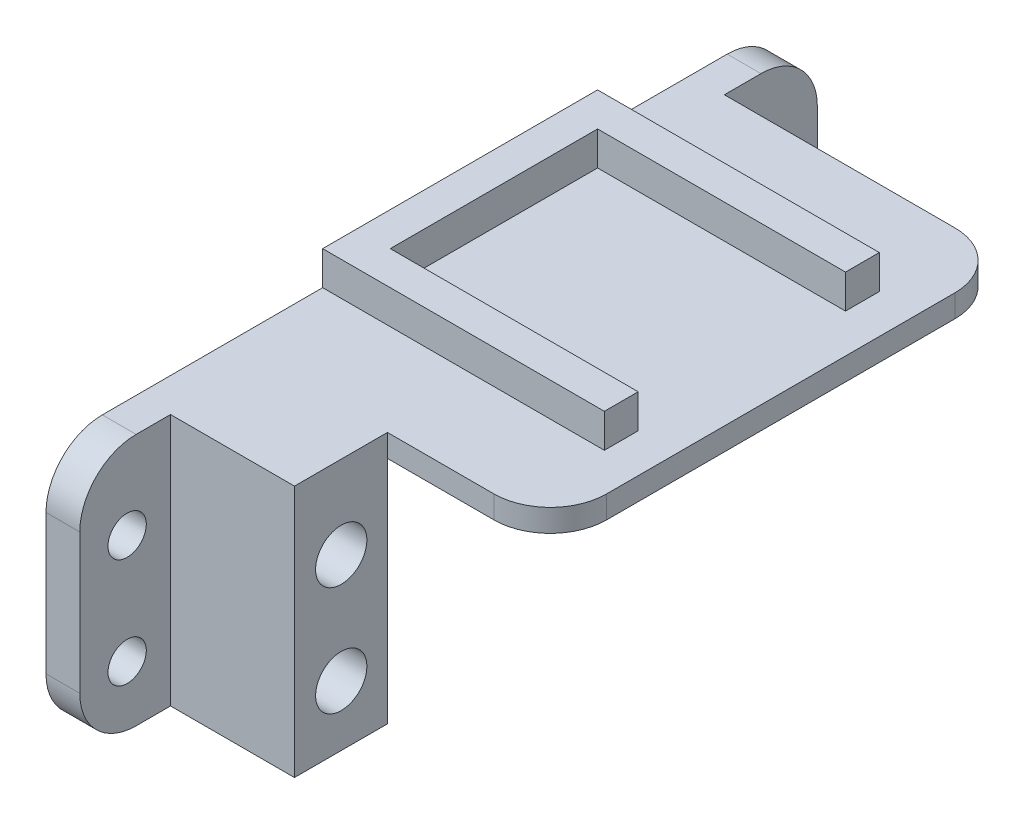
ISO-10303-21;
HEADER;
FILE_DESCRIPTION(('STEP AP214'),'2;1');
FILE_NAME('part.step','',(''),(''),'','','');
FILE_SCHEMA(('AUTOMOTIVE_DESIGN { 1 0 10303 214 1 1 1 1 }'));
ENDSEC;
DATA;
#1=APPLICATION_CONTEXT('core data for automotive mechanical design processes');
#2=APPLICATION_PROTOCOL_DEFINITION('international standard','automotive_design',2000,#1);
#3=PRODUCT_CONTEXT('',#1,'mechanical');
#4=PRODUCT('Part','Part','',(#3));
#5=PRODUCT_RELATED_PRODUCT_CATEGORY('part','',(#4));
#6=PRODUCT_DEFINITION_FORMATION('','',#4);
#7=PRODUCT_DEFINITION_CONTEXT('part definition',#1,'design');
#8=PRODUCT_DEFINITION('design','',#6,#7);
#9=PRODUCT_DEFINITION_SHAPE('','',#8);
#10=(LENGTH_UNIT() NAMED_UNIT(*) SI_UNIT(.MILLI.,.METRE.));
#11=(NAMED_UNIT(*) PLANE_ANGLE_UNIT() SI_UNIT($,.RADIAN.));
#12=(NAMED_UNIT(*) SI_UNIT($,.STERADIAN.) SOLID_ANGLE_UNIT());
#13=UNCERTAINTY_MEASURE_WITH_UNIT(LENGTH_MEASURE(1.E-05),#10,'distance_accuracy_value','');
#14=(GEOMETRIC_REPRESENTATION_CONTEXT(3) GLOBAL_UNCERTAINTY_ASSIGNED_CONTEXT((#13)) GLOBAL_UNIT_ASSIGNED_CONTEXT((#10,
#11,#12)) REPRESENTATION_CONTEXT('',''));
#15=CARTESIAN_POINT('',(0.,0.,0.));
#16=DIRECTION('',(0.,0.,1.));
#17=DIRECTION('',(1.,0.,0.));
#18=AXIS2_PLACEMENT_3D('',#15,#16,#17);
#19=CARTESIAN_POINT('',(0.,0.,0.));
#20=DIRECTION('',(0.,1.,0.));
#21=DIRECTION('',(0.,0.,1.));
#22=AXIS2_PLACEMENT_3D('',#19,#20,#21);
#23=PLANE('',#22);
#24=DIRECTION('',(0.,0.,-1.));
#25=VECTOR('',#24,1.);
#26=CARTESIAN_POINT('',(-6.07499999999999,0.,0.));
#27=LINE('',#26,#25);
#28=CARTESIAN_POINT('',(-6.07499999999999,0.,20.45));
#29=VERTEX_POINT('',#28);
#30=CARTESIAN_POINT('',(-6.07499999999999,0.,-20.45));
#31=VERTEX_POINT('',#30);
#32=EDGE_CURVE('E308',#29,#31,#27,.T.);
#33=ORIENTED_EDGE('',*,*,#32,.T.);
#34=DIRECTION('',(-1.,0.,0.));
#35=VECTOR('',#34,1.);
#36=CARTESIAN_POINT('',(0.,0.,-20.45));
#37=LINE('',#36,#35);
#38=CARTESIAN_POINT('',(-3.075,0.,-20.45));
#39=VERTEX_POINT('',#38);
#40=EDGE_CURVE('E272',#39,#31,#37,.T.);
#41=ORIENTED_EDGE('',*,*,#40,.F.);
#42=DIRECTION('',(-1.,0.,0.));
#43=VECTOR('',#42,1.);
#44=CARTESIAN_POINT('',(0.,0.,-20.45));
#45=LINE('',#44,#43);
#46=CARTESIAN_POINT('',(17.375,0.,-20.45));
#47=VERTEX_POINT('',#46);
#48=EDGE_CURVE('E337',#47,#39,#45,.T.);
#49=ORIENTED_EDGE('',*,*,#48,.F.);
#50=CARTESIAN_POINT('',(17.375,0.,-15.45));
#51=DIRECTION('',(0.,1.,0.));
#52=DIRECTION('',(0.,0.,1.));
#53=AXIS2_PLACEMENT_3D('',#50,#51,#52);
#54=CIRCLE('',#53,5.);
#55=CARTESIAN_POINT('',(22.375,0.,-15.45));
#56=VERTEX_POINT('',#55);
#57=EDGE_CURVE('E394',#47,#56,#54,.F.);
#58=ORIENTED_EDGE('',*,*,#57,.T.);
#59=DIRECTION('',(0.,0.,1.));
#60=VECTOR('',#59,1.);
#61=CARTESIAN_POINT('',(22.375,0.,0.));
#62=LINE('',#61,#60);
#63=CARTESIAN_POINT('',(22.375,0.,15.45));
#64=VERTEX_POINT('',#63);
#65=EDGE_CURVE('E334',#56,#64,#62,.T.);
#66=ORIENTED_EDGE('',*,*,#65,.T.);
#67=CARTESIAN_POINT('',(17.375,0.,15.45));
#68=DIRECTION('',(0.,1.,0.));
#69=DIRECTION('',(0.,0.,1.));
#70=AXIS2_PLACEMENT_3D('',#67,#68,#69);
#71=CIRCLE('',#70,5.);
#72=CARTESIAN_POINT('',(17.375,0.,20.45));
#73=VERTEX_POINT('',#72);
#74=EDGE_CURVE('E392',#64,#73,#71,.F.);
#75=ORIENTED_EDGE('',*,*,#74,.T.);
#76=DIRECTION('',(-1.,0.,0.));
#77=VECTOR('',#76,1.);
#78=CARTESIAN_POINT('',(0.,0.,20.45));
#79=LINE('',#78,#77);
#80=CARTESIAN_POINT('',(7.925,0.,20.45));
#81=VERTEX_POINT('',#80);
#82=EDGE_CURVE('E332',#73,#81,#79,.T.);
#83=ORIENTED_EDGE('',*,*,#82,.T.);
#84=DIRECTION('',(-1.,0.,0.));
#85=VECTOR('',#84,1.);
#86=CARTESIAN_POINT('',(0.,0.,20.45));
#87=LINE('',#86,#85);
#88=EDGE_CURVE('E289',#81,#29,#87,.T.);
#89=ORIENTED_EDGE('',*,*,#88,.T.);
#90=EDGE_LOOP('',(#33,#41,#49,#58,#66,#75,#83,#89));
#91=FACE_BOUND('',#90,.T.);
#92=ADVANCED_FACE('F38',(#91),#23,.F.);
#93=CARTESIAN_POINT('',(-6.07499999999999,2.,0.));
#94=DIRECTION('',(-1.,0.,0.));
#95=DIRECTION('',(0.,0.,1.));
#96=AXIS2_PLACEMENT_3D('',#93,#94,#95);
#97=PLANE('',#96);
#98=DIRECTION('',(0.,1.,0.));
#99=VECTOR('',#98,1.);
#100=CARTESIAN_POINT('',(-6.07499999999999,-20.4,-20.45));
#101=LINE('',#100,#99);
#102=CARTESIAN_POINT('',(-6.07499999999999,-20.4,-20.45));
#103=VERTEX_POINT('',#102);
#104=EDGE_CURVE('E283',#103,#31,#101,.T.);
#105=ORIENTED_EDGE('',*,*,#104,.T.);
#106=ORIENTED_EDGE('',*,*,#32,.F.);
#107=DIRECTION('',(0.,1.,0.));
#108=VECTOR('',#107,1.);
#109=CARTESIAN_POINT('',(-6.07499999999999,-20.4,20.45));
#110=LINE('',#109,#108);
#111=CARTESIAN_POINT('',(-6.07499999999999,-20.4,20.45));
#112=VERTEX_POINT('',#111);
#113=EDGE_CURVE('E306',#112,#29,#110,.T.);
#114=ORIENTED_EDGE('',*,*,#113,.F.);
#115=DIRECTION('',(0.,0.,1.));
#116=VECTOR('',#115,1.);
#117=CARTESIAN_POINT('',(-6.07499999999996,-20.4,0.));
#118=LINE('',#117,#116);
#119=CARTESIAN_POINT('',(-6.075,-20.4,31.75));
#120=VERTEX_POINT('',#119);
#121=EDGE_CURVE('E298',#112,#120,#118,.T.);
#122=ORIENTED_EDGE('',*,*,#121,.T.);
#123=CARTESIAN_POINT('',(-6.07499999999999,-15.4,31.75));
#124=DIRECTION('',(-1.,0.,0.));
#125=DIRECTION('',(0.,0.,1.));
#126=AXIS2_PLACEMENT_3D('',#123,#124,#125);
#127=CIRCLE('',#126,5.);
#128=CARTESIAN_POINT('',(-6.07499999999999,-15.4,36.75));
#129=VERTEX_POINT('',#128);
#130=EDGE_CURVE('E385',#120,#129,#127,.T.);
#131=ORIENTED_EDGE('',*,*,#130,.T.);
#132=DIRECTION('',(0.,1.,0.));
#133=VECTOR('',#132,1.);
#134=CARTESIAN_POINT('',(-6.07499999999999,2.,36.75));
#135=LINE('',#134,#133);
#136=CARTESIAN_POINT('',(-6.07499999999999,-3.,36.75));
#137=VERTEX_POINT('',#136);
#138=EDGE_CURVE('E264',#129,#137,#135,.T.);
#139=ORIENTED_EDGE('',*,*,#138,.T.);
#140=CARTESIAN_POINT('',(-6.07499999999999,-3.,31.75));
#141=DIRECTION('',(-1.,0.,0.));
#142=DIRECTION('',(0.,0.,1.));
#143=AXIS2_PLACEMENT_3D('',#140,#141,#142);
#144=CIRCLE('',#143,5.);
#145=CARTESIAN_POINT('',(-6.07499999999999,2.,31.75));
#146=VERTEX_POINT('',#145);
#147=EDGE_CURVE('E381',#137,#146,#144,.T.);
#148=ORIENTED_EDGE('',*,*,#147,.T.);
#149=DIRECTION('',(0.,0.,-1.));
#150=VECTOR('',#149,1.);
#151=CARTESIAN_POINT('',(-6.07499999999999,2.,0.));
#152=LINE('',#151,#150);
#153=CARTESIAN_POINT('',(-6.07499999999999,2.,12.2));
#154=VERTEX_POINT('',#153);
#155=EDGE_CURVE('E311',#146,#154,#152,.T.);
#156=ORIENTED_EDGE('',*,*,#155,.T.);
#157=DIRECTION('',(0.,-1.,0.));
#158=VECTOR('',#157,1.);
#159=CARTESIAN_POINT('',(-6.07499999999998,5.,12.2));
#160=LINE('',#159,#158);
#161=CARTESIAN_POINT('',(-6.07499999999998,5.,12.2));
#162=VERTEX_POINT('',#161);
#163=EDGE_CURVE('E453',#162,#154,#160,.T.);
#164=ORIENTED_EDGE('',*,*,#163,.F.);
#165=DIRECTION('',(0.,0.,-1.));
#166=VECTOR('',#165,1.);
#167=CARTESIAN_POINT('',(-6.07499999999999,5.,0.));
#168=LINE('',#167,#166);
#169=CARTESIAN_POINT('',(-6.07499999999999,5.,-12.2));
#170=VERTEX_POINT('',#169);
#171=EDGE_CURVE('E461',#162,#170,#168,.T.);
#172=ORIENTED_EDGE('',*,*,#171,.T.);
#173=DIRECTION('',(0.,-1.,0.));
#174=VECTOR('',#173,1.);
#175=CARTESIAN_POINT('',(-6.07499999999999,5.,-12.2));
#176=LINE('',#175,#174);
#177=CARTESIAN_POINT('',(-6.07499999999999,2.,-12.2));
#178=VERTEX_POINT('',#177);
#179=EDGE_CURVE('E241',#170,#178,#176,.T.);
#180=ORIENTED_EDGE('',*,*,#179,.T.);
#181=CARTESIAN_POINT('',(-6.07499999999999,2.,-23.7));
#182=VERTEX_POINT('',#181);
#183=EDGE_CURVE('E315',#178,#182,#152,.T.);
#184=ORIENTED_EDGE('',*,*,#183,.T.);
#185=CARTESIAN_POINT('',(-6.07499999999999,-3.,-23.7));
#186=DIRECTION('',(-1.,0.,0.));
#187=DIRECTION('',(0.,0.,1.));
#188=AXIS2_PLACEMENT_3D('',#185,#186,#187);
#189=CIRCLE('',#188,5.);
#190=CARTESIAN_POINT('',(-6.07499999999999,-3.,-28.7));
#191=VERTEX_POINT('',#190);
#192=EDGE_CURVE('E383',#182,#191,#189,.T.);
#193=ORIENTED_EDGE('',*,*,#192,.T.);
#194=DIRECTION('',(0.,-1.,0.));
#195=VECTOR('',#194,1.);
#196=CARTESIAN_POINT('',(-6.07499999999999,2.,-28.7));
#197=LINE('',#196,#195);
#198=CARTESIAN_POINT('',(-6.07499999999999,-15.4,-28.7));
#199=VERTEX_POINT('',#198);
#200=EDGE_CURVE('E330',#191,#199,#197,.T.);
#201=ORIENTED_EDGE('',*,*,#200,.T.);
#202=CARTESIAN_POINT('',(-6.07499999999999,-15.4,-23.7));
#203=DIRECTION('',(-1.,0.,0.));
#204=DIRECTION('',(0.,0.,1.));
#205=AXIS2_PLACEMENT_3D('',#202,#203,#204);
#206=CIRCLE('',#205,5.);
#207=CARTESIAN_POINT('',(-6.07499999999999,-20.4,-23.7));
#208=VERTEX_POINT('',#207);
#209=EDGE_CURVE('E387',#199,#208,#206,.T.);
#210=ORIENTED_EDGE('',*,*,#209,.T.);
#211=DIRECTION('',(0.,0.,-1.));
#212=VECTOR('',#211,1.);
#213=CARTESIAN_POINT('',(-6.07499999999996,-20.4,0.));
#214=LINE('',#213,#212);
#215=EDGE_CURVE('E278',#103,#208,#214,.T.);
#216=ORIENTED_EDGE('',*,*,#215,.F.);
#217=EDGE_LOOP('',(#105,#106,#114,#122,#131,#139,#148,#156,#164,#172,#180,#184,#193,#201,#210,#216));
#218=FACE_BOUND('',#217,.T.);
#219=CARTESIAN_POINT('',(-6.07499999999999,-5.35,-24.55));
#220=DIRECTION('',(-1.,0.,0.));
#221=DIRECTION('',(0.,0.,1.));
#222=AXIS2_PLACEMENT_3D('',#219,#220,#221);
#223=CIRCLE('',#222,1.7);
#224=CARTESIAN_POINT('',(-6.07499999999999,-5.35,-22.85));
#225=VERTEX_POINT('',#224);
#226=EDGE_CURVE('E248',#225,#225,#223,.T.);
#227=ORIENTED_EDGE('',*,*,#226,.F.);
#228=EDGE_LOOP('',(#227));
#229=FACE_BOUND('',#228,.T.);
#230=CARTESIAN_POINT('',(-6.07499999999999,-15.05,-24.55));
#231=DIRECTION('',(-1.,0.,0.));
#232=DIRECTION('',(0.,0.,1.));
#233=AXIS2_PLACEMENT_3D('',#230,#231,#232);
#234=CIRCLE('',#233,1.7);
#235=CARTESIAN_POINT('',(-6.07499999999999,-15.05,-22.85));
#236=VERTEX_POINT('',#235);
#237=EDGE_CURVE('E254',#236,#236,#234,.T.);
#238=ORIENTED_EDGE('',*,*,#237,.F.);
#239=EDGE_LOOP('',(#238));
#240=FACE_BOUND('',#239,.T.);
#241=CARTESIAN_POINT('',(-6.07499999999999,-5.35,32.55));
#242=DIRECTION('',(-1.,0.,0.));
#243=DIRECTION('',(0.,0.,1.));
#244=AXIS2_PLACEMENT_3D('',#241,#242,#243);
#245=CIRCLE('',#244,1.7);
#246=CARTESIAN_POINT('',(-6.07499999999999,-5.35,34.25));
#247=VERTEX_POINT('',#246);
#248=EDGE_CURVE('E236',#247,#247,#245,.T.);
#249=ORIENTED_EDGE('',*,*,#248,.F.);
#250=EDGE_LOOP('',(#249));
#251=FACE_BOUND('',#250,.T.);
#252=CARTESIAN_POINT('',(-6.07499999999999,-15.05,24.55));
#253=DIRECTION('',(-1.,0.,0.));
#254=DIRECTION('',(0.,0.,1.));
#255=AXIS2_PLACEMENT_3D('',#252,#253,#254);
#256=CIRCLE('',#255,2.275);
#257=CARTESIAN_POINT('',(-6.07499999999999,-15.05,26.825));
#258=VERTEX_POINT('',#257);
#259=EDGE_CURVE('E251',#258,#258,#256,.T.);
#260=ORIENTED_EDGE('',*,*,#259,.F.);
#261=EDGE_LOOP('',(#260));
#262=FACE_BOUND('',#261,.T.);
#263=CARTESIAN_POINT('',(-6.07499999999999,-5.35,24.55));
#264=DIRECTION('',(-1.,0.,0.));
#265=DIRECTION('',(0.,0.,1.));
#266=AXIS2_PLACEMENT_3D('',#263,#264,#265);
#267=CIRCLE('',#266,2.275);
#268=CARTESIAN_POINT('',(-6.07499999999999,-5.35,26.825));
#269=VERTEX_POINT('',#268);
#270=EDGE_CURVE('E245',#269,#269,#267,.T.);
#271=ORIENTED_EDGE('',*,*,#270,.F.);
#272=EDGE_LOOP('',(#271));
#273=FACE_BOUND('',#272,.T.);
#274=CARTESIAN_POINT('',(-6.07499999999999,-15.05,32.55));
#275=DIRECTION('',(-1.,0.,0.));
#276=DIRECTION('',(0.,0.,1.));
#277=AXIS2_PLACEMENT_3D('',#274,#275,#276);
#278=CIRCLE('',#277,1.7);
#279=CARTESIAN_POINT('',(-6.07499999999999,-15.05,34.25));
#280=VERTEX_POINT('',#279);
#281=EDGE_CURVE('E239',#280,#280,#278,.T.);
#282=ORIENTED_EDGE('',*,*,#281,.F.);
#283=EDGE_LOOP('',(#282));
#284=FACE_BOUND('',#283,.T.);
#285=ADVANCED_FACE('F458',(#218,#229,#240,#251,#262,#273,#284),#97,.T.);
#286=CARTESIAN_POINT('',(0.,2.,28.7));
#287=DIRECTION('',(0.,0.,-1.));
#288=DIRECTION('',(-1.,0.,0.));
#289=AXIS2_PLACEMENT_3D('',#286,#287,#288);
#290=PLANE('',#289);
#291=DIRECTION('',(1.,0.,0.));
#292=VECTOR('',#291,1.);
#293=CARTESIAN_POINT('',(0.,2.,28.7));
#294=LINE('',#293,#292);
#295=CARTESIAN_POINT('',(-3.07499999999999,2.,28.7));
#296=VERTEX_POINT('',#295);
#297=CARTESIAN_POINT('',(7.925,2.,28.7));
#298=VERTEX_POINT('',#297);
#299=EDGE_CURVE('E314',#296,#298,#294,.T.);
#300=ORIENTED_EDGE('',*,*,#299,.F.);
#301=DIRECTION('',(0.,-1.,0.));
#302=VECTOR('',#301,1.);
#303=CARTESIAN_POINT('',(-3.07499999999999,2.,28.7));
#304=LINE('',#303,#302);
#305=CARTESIAN_POINT('',(-3.07499999999999,-20.4,28.7));
#306=VERTEX_POINT('',#305);
#307=EDGE_CURVE('E266',#296,#306,#304,.T.);
#308=ORIENTED_EDGE('',*,*,#307,.T.);
#309=DIRECTION('',(1.,0.,0.));
#310=VECTOR('',#309,1.);
#311=CARTESIAN_POINT('',(0.,-20.4,28.7));
#312=LINE('',#311,#310);
#313=CARTESIAN_POINT('',(7.925,-20.4,28.7));
#314=VERTEX_POINT('',#313);
#315=EDGE_CURVE('E301',#306,#314,#312,.T.);
#316=ORIENTED_EDGE('',*,*,#315,.T.);
#317=DIRECTION('',(0.,-1.,0.));
#318=VECTOR('',#317,1.);
#319=CARTESIAN_POINT('',(7.925,2.,28.7));
#320=LINE('',#319,#318);
#321=EDGE_CURVE('E350',#298,#314,#320,.T.);
#322=ORIENTED_EDGE('',*,*,#321,.F.);
#323=EDGE_LOOP('',(#300,#308,#316,#322));
#324=FACE_BOUND('',#323,.T.);
#325=ADVANCED_FACE('F509',(#324),#290,.F.);
#326=CARTESIAN_POINT('',(7.92499999999999,2.,0.));
#327=DIRECTION('',(1.,0.,0.));
#328=DIRECTION('',(0.,0.,-1.));
#329=AXIS2_PLACEMENT_3D('',#326,#327,#328);
#330=PLANE('',#329);
#331=CARTESIAN_POINT('',(7.925,-5.35,24.55));
#332=DIRECTION('',(1.,0.,0.));
#333=DIRECTION('',(0.,0.,-1.));
#334=AXIS2_PLACEMENT_3D('',#331,#332,#333);
#335=CIRCLE('',#334,2.275);
#336=CARTESIAN_POINT('',(7.925,-5.35,22.275));
#337=VERTEX_POINT('',#336);
#338=EDGE_CURVE('E275',#337,#337,#335,.T.);
#339=ORIENTED_EDGE('',*,*,#338,.F.);
#340=EDGE_LOOP('',(#339));
#341=FACE_BOUND('',#340,.T.);
#342=CARTESIAN_POINT('',(7.925,-15.05,24.55));
#343=DIRECTION('',(1.,0.,0.));
#344=DIRECTION('',(0.,0.,-1.));
#345=AXIS2_PLACEMENT_3D('',#342,#343,#344);
#346=CIRCLE('',#345,2.275);
#347=CARTESIAN_POINT('',(7.925,-15.05,22.275));
#348=VERTEX_POINT('',#347);
#349=EDGE_CURVE('E365',#348,#348,#346,.T.);
#350=ORIENTED_EDGE('',*,*,#349,.F.);
#351=EDGE_LOOP('',(#350));
#352=FACE_BOUND('',#351,.T.);
#353=ORIENTED_EDGE('',*,*,#321,.T.);
#354=DIRECTION('',(0.,0.,1.));
#355=VECTOR('',#354,1.);
#356=CARTESIAN_POINT('',(7.92499999999999,-20.4,0.));
#357=LINE('',#356,#355);
#358=CARTESIAN_POINT('',(7.925,-20.4,20.45));
#359=VERTEX_POINT('',#358);
#360=EDGE_CURVE('E292',#359,#314,#357,.T.);
#361=ORIENTED_EDGE('',*,*,#360,.F.);
#362=DIRECTION('',(0.,1.,0.));
#363=VECTOR('',#362,1.);
#364=CARTESIAN_POINT('',(7.925,-20.4,20.45));
#365=LINE('',#364,#363);
#366=EDGE_CURVE('E303',#359,#81,#365,.T.);
#367=ORIENTED_EDGE('',*,*,#366,.T.);
#368=DIRECTION('',(0.,-1.,0.));
#369=VECTOR('',#368,1.);
#370=CARTESIAN_POINT('',(7.925,2.,20.45));
#371=LINE('',#370,#369);
#372=CARTESIAN_POINT('',(7.925,2.,20.45));
#373=VERTEX_POINT('',#372);
#374=EDGE_CURVE('E347',#373,#81,#371,.T.);
#375=ORIENTED_EDGE('',*,*,#374,.F.);
#376=DIRECTION('',(0.,0.,1.));
#377=VECTOR('',#376,1.);
#378=CARTESIAN_POINT('',(7.92499999999999,2.,0.));
#379=LINE('',#378,#377);
#380=EDGE_CURVE('E317',#373,#298,#379,.T.);
#381=ORIENTED_EDGE('',*,*,#380,.T.);
#382=EDGE_LOOP('',(#353,#361,#367,#375,#381));
#383=FACE_BOUND('',#382,.T.);
#384=ADVANCED_FACE('F511',(#341,#352,#383),#330,.T.);
#385=CARTESIAN_POINT('',(0.,2.,20.45));
#386=DIRECTION('',(0.,0.,1.));
#387=DIRECTION('',(1.,0.,0.));
#388=AXIS2_PLACEMENT_3D('',#385,#386,#387);
#389=PLANE('',#388);
#390=ORIENTED_EDGE('',*,*,#82,.F.);
#391=DIRECTION('',(0.,-1.,0.));
#392=VECTOR('',#391,1.);
#393=CARTESIAN_POINT('',(17.375,2.,20.45));
#394=LINE('',#393,#392);
#395=CARTESIAN_POINT('',(17.375,2.,20.45));
#396=VERTEX_POINT('',#395);
#397=EDGE_CURVE('E410',#73,#396,#394,.F.);
#398=ORIENTED_EDGE('',*,*,#397,.T.);
#399=DIRECTION('',(-1.,0.,0.));
#400=VECTOR('',#399,1.);
#401=CARTESIAN_POINT('',(0.,2.,20.45));
#402=LINE('',#401,#400);
#403=EDGE_CURVE('E320',#396,#373,#402,.T.);
#404=ORIENTED_EDGE('',*,*,#403,.T.);
#405=ORIENTED_EDGE('',*,*,#374,.T.);
#406=EDGE_LOOP('',(#390,#398,#404,#405));
#407=FACE_BOUND('',#406,.T.);
#408=ADVANCED_FACE('F568',(#407),#389,.T.);
#409=CARTESIAN_POINT('',(22.375,2.,0.));
#410=DIRECTION('',(1.,0.,0.));
#411=DIRECTION('',(0.,0.,-1.));
#412=AXIS2_PLACEMENT_3D('',#409,#410,#411);
#413=PLANE('',#412);
#414=ORIENTED_EDGE('',*,*,#65,.F.);
#415=DIRECTION('',(0.,-1.,0.));
#416=VECTOR('',#415,1.);
#417=CARTESIAN_POINT('',(22.375,2.,-15.45));
#418=LINE('',#417,#416);
#419=CARTESIAN_POINT('',(22.375,2.,-15.45));
#420=VERTEX_POINT('',#419);
#421=EDGE_CURVE('E399',#56,#420,#418,.F.);
#422=ORIENTED_EDGE('',*,*,#421,.T.);
#423=DIRECTION('',(0.,0.,1.));
#424=VECTOR('',#423,1.);
#425=CARTESIAN_POINT('',(22.375,2.,0.));
#426=LINE('',#425,#424);
#427=CARTESIAN_POINT('',(22.375,2.,15.45));
#428=VERTEX_POINT('',#427);
#429=EDGE_CURVE('E322',#420,#428,#426,.T.);
#430=ORIENTED_EDGE('',*,*,#429,.T.);
#431=DIRECTION('',(0.,-1.,0.));
#432=VECTOR('',#431,1.);
#433=CARTESIAN_POINT('',(22.375,2.,15.45));
#434=LINE('',#433,#432);
#435=EDGE_CURVE('E396',#428,#64,#434,.T.);
#436=ORIENTED_EDGE('',*,*,#435,.T.);
#437=EDGE_LOOP('',(#414,#422,#430,#436));
#438=FACE_BOUND('',#437,.T.);
#439=ADVANCED_FACE('F524',(#438),#413,.T.);
#440=CARTESIAN_POINT('',(0.,2.,-20.45));
#441=DIRECTION('',(0.,0.,1.));
#442=DIRECTION('',(1.,0.,0.));
#443=AXIS2_PLACEMENT_3D('',#440,#441,#442);
#444=PLANE('',#443);
#445=DIRECTION('',(-1.,0.,0.));
#446=VECTOR('',#445,1.);
#447=CARTESIAN_POINT('',(0.,2.,-20.45));
#448=LINE('',#447,#446);
#449=CARTESIAN_POINT('',(17.375,2.,-20.45));
#450=VERTEX_POINT('',#449);
#451=CARTESIAN_POINT('',(-3.075,2.,-20.45));
#452=VERTEX_POINT('',#451);
#453=EDGE_CURVE('E325',#450,#452,#448,.T.);
#454=ORIENTED_EDGE('',*,*,#453,.F.);
#455=DIRECTION('',(0.,-1.,0.));
#456=VECTOR('',#455,1.);
#457=CARTESIAN_POINT('',(17.375,0.,-20.45));
#458=LINE('',#457,#456);
#459=EDGE_CURVE('E389',#450,#47,#458,.T.);
#460=ORIENTED_EDGE('',*,*,#459,.T.);
#461=ORIENTED_EDGE('',*,*,#48,.T.);
#462=DIRECTION('',(0.,-1.,0.));
#463=VECTOR('',#462,1.);
#464=CARTESIAN_POINT('',(-3.075,2.,-20.45));
#465=LINE('',#464,#463);
#466=EDGE_CURVE('E344',#452,#39,#465,.T.);
#467=ORIENTED_EDGE('',*,*,#466,.F.);
#468=EDGE_LOOP('',(#454,#460,#461,#467));
#469=FACE_BOUND('',#468,.T.);
#470=ADVANCED_FACE('F536',(#469),#444,.F.);
#471=CARTESIAN_POINT('',(-3.075,2.,0.));
#472=DIRECTION('',(1.,0.,0.));
#473=DIRECTION('',(0.,0.,-1.));
#474=AXIS2_PLACEMENT_3D('',#471,#472,#473);
#475=PLANE('',#474);
#476=CARTESIAN_POINT('',(-3.075,-5.35,-24.55));
#477=DIRECTION('',(1.,0.,0.));
#478=DIRECTION('',(0.,0.,-1.));
#479=AXIS2_PLACEMENT_3D('',#476,#477,#478);
#480=CIRCLE('',#479,1.7);
#481=CARTESIAN_POINT('',(-3.075,-5.35,-26.25));
#482=VERTEX_POINT('',#481);
#483=EDGE_CURVE('E362',#482,#482,#480,.T.);
#484=ORIENTED_EDGE('',*,*,#483,.F.);
#485=EDGE_LOOP('',(#484));
#486=FACE_BOUND('',#485,.T.);
#487=CARTESIAN_POINT('',(-3.075,-15.05,-24.55));
#488=DIRECTION('',(1.,0.,0.));
#489=DIRECTION('',(0.,0.,-1.));
#490=AXIS2_PLACEMENT_3D('',#487,#488,#489);
#491=CIRCLE('',#490,1.7);
#492=CARTESIAN_POINT('',(-3.075,-15.05,-26.25));
#493=VERTEX_POINT('',#492);
#494=EDGE_CURVE('E359',#493,#493,#491,.T.);
#495=ORIENTED_EDGE('',*,*,#494,.F.);
#496=EDGE_LOOP('',(#495));
#497=FACE_BOUND('',#496,.T.);
#498=DIRECTION('',(0.,0.,1.));
#499=VECTOR('',#498,1.);
#500=CARTESIAN_POINT('',(-3.075,-20.4,0.));
#501=LINE('',#500,#499);
#502=CARTESIAN_POINT('',(-3.075,-20.4,-23.7));
#503=VERTEX_POINT('',#502);
#504=CARTESIAN_POINT('',(-3.075,-20.4,-20.45));
#505=VERTEX_POINT('',#504);
#506=EDGE_CURVE('E276',#503,#505,#501,.T.);
#507=ORIENTED_EDGE('',*,*,#506,.F.);
#508=CARTESIAN_POINT('',(-3.075,-15.4,-23.7));
#509=DIRECTION('',(1.,0.,0.));
#510=DIRECTION('',(0.,0.,-1.));
#511=AXIS2_PLACEMENT_3D('',#508,#509,#510);
#512=CIRCLE('',#511,5.);
#513=CARTESIAN_POINT('',(-3.075,-15.4,-28.7));
#514=VERTEX_POINT('',#513);
#515=EDGE_CURVE('E374',#503,#514,#512,.T.);
#516=ORIENTED_EDGE('',*,*,#515,.T.);
#517=DIRECTION('',(0.,-1.,0.));
#518=VECTOR('',#517,1.);
#519=CARTESIAN_POINT('',(-3.075,2.,-28.7));
#520=LINE('',#519,#518);
#521=CARTESIAN_POINT('',(-3.075,-3.,-28.7));
#522=VERTEX_POINT('',#521);
#523=EDGE_CURVE('E341',#522,#514,#520,.T.);
#524=ORIENTED_EDGE('',*,*,#523,.F.);
#525=CARTESIAN_POINT('',(-3.075,-3.,-23.7));
#526=DIRECTION('',(1.,0.,0.));
#527=DIRECTION('',(0.,0.,-1.));
#528=AXIS2_PLACEMENT_3D('',#525,#526,#527);
#529=CIRCLE('',#528,5.);
#530=CARTESIAN_POINT('',(-3.075,2.,-23.7));
#531=VERTEX_POINT('',#530);
#532=EDGE_CURVE('E372',#522,#531,#529,.T.);
#533=ORIENTED_EDGE('',*,*,#532,.T.);
#534=DIRECTION('',(0.,0.,1.));
#535=VECTOR('',#534,1.);
#536=CARTESIAN_POINT('',(-3.075,2.,0.));
#537=LINE('',#536,#535);
#538=EDGE_CURVE('E327',#531,#452,#537,.T.);
#539=ORIENTED_EDGE('',*,*,#538,.T.);
#540=ORIENTED_EDGE('',*,*,#466,.T.);
#541=DIRECTION('',(0.,1.,0.));
#542=VECTOR('',#541,1.);
#543=CARTESIAN_POINT('',(-3.075,-20.4,-20.45));
#544=LINE('',#543,#542);
#545=EDGE_CURVE('E286',#505,#39,#544,.T.);
#546=ORIENTED_EDGE('',*,*,#545,.F.);
#547=EDGE_LOOP('',(#507,#516,#524,#533,#539,#540,#546));
#548=FACE_BOUND('',#547,.T.);
#549=ADVANCED_FACE('F542',(#486,#497,#548),#475,.T.);
#550=CARTESIAN_POINT('',(0.,2.,-28.7));
#551=DIRECTION('',(0.,0.,-1.));
#552=DIRECTION('',(-1.,0.,0.));
#553=AXIS2_PLACEMENT_3D('',#550,#551,#552);
#554=PLANE('',#553);
#555=ORIENTED_EDGE('',*,*,#523,.T.);
#556=DIRECTION('',(1.,0.,0.));
#557=VECTOR('',#556,1.);
#558=CARTESIAN_POINT('',(-6.07499999999999,-15.4,-28.7));
#559=LINE('',#558,#557);
#560=EDGE_CURVE('E379',#514,#199,#559,.F.);
#561=ORIENTED_EDGE('',*,*,#560,.T.);
#562=ORIENTED_EDGE('',*,*,#200,.F.);
#563=DIRECTION('',(1.,0.,0.));
#564=VECTOR('',#563,1.);
#565=CARTESIAN_POINT('',(0.,-3.,-28.7));
#566=LINE('',#565,#564);
#567=EDGE_CURVE('E376',#191,#522,#566,.T.);
#568=ORIENTED_EDGE('',*,*,#567,.T.);
#569=EDGE_LOOP('',(#555,#561,#562,#568));
#570=FACE_BOUND('',#569,.T.);
#571=ADVANCED_FACE('F551',(#570),#554,.T.);
#572=CARTESIAN_POINT('',(0.,2.,0.));
#573=DIRECTION('',(0.,1.,0.));
#574=DIRECTION('',(0.,0.,1.));
#575=AXIS2_PLACEMENT_3D('',#572,#573,#574);
#576=PLANE('',#575);
#577=DIRECTION('',(-1.,0.,0.));
#578=VECTOR('',#577,1.);
#579=CARTESIAN_POINT('',(0.,2.,-12.2));
#580=LINE('',#579,#578);
#581=CARTESIAN_POINT('',(18.925,2.,-12.2));
#582=VERTEX_POINT('',#581);
#583=EDGE_CURVE('E11',#582,#178,#580,.T.);
#584=ORIENTED_EDGE('',*,*,#583,.F.);
#585=DIRECTION('',(0.,0.,1.));
#586=VECTOR('',#585,1.);
#587=CARTESIAN_POINT('',(18.925,2.,0.));
#588=LINE('',#587,#586);
#589=CARTESIAN_POINT('',(18.925,2.,-9.2));
#590=VERTEX_POINT('',#589);
#591=EDGE_CURVE('E46',#582,#590,#588,.T.);
#592=ORIENTED_EDGE('',*,*,#591,.T.);
#593=DIRECTION('',(-1.,0.,0.));
#594=VECTOR('',#593,1.);
#595=CARTESIAN_POINT('',(0.,2.,-9.2));
#596=LINE('',#595,#594);
#597=CARTESIAN_POINT('',(-3.07499999999999,2.,-9.2));
#598=VERTEX_POINT('',#597);
#599=EDGE_CURVE('E235',#590,#598,#596,.T.);
#600=ORIENTED_EDGE('',*,*,#599,.T.);
#601=DIRECTION('',(0.,0.,-1.));
#602=VECTOR('',#601,1.);
#603=CARTESIAN_POINT('',(-3.07499999999998,2.,0.));
#604=LINE('',#603,#602);
#605=CARTESIAN_POINT('',(-3.07499999999998,2.,9.2));
#606=VERTEX_POINT('',#605);
#607=EDGE_CURVE('E424',#606,#598,#604,.T.);
#608=ORIENTED_EDGE('',*,*,#607,.F.);
#609=DIRECTION('',(-1.,0.,0.));
#610=VECTOR('',#609,1.);
#611=CARTESIAN_POINT('',(0.,2.,9.2));
#612=LINE('',#611,#610);
#613=CARTESIAN_POINT('',(18.925,2.,9.2));
#614=VERTEX_POINT('',#613);
#615=EDGE_CURVE('E427',#614,#606,#612,.T.);
#616=ORIENTED_EDGE('',*,*,#615,.F.);
#617=DIRECTION('',(0.,0.,-1.));
#618=VECTOR('',#617,1.);
#619=CARTESIAN_POINT('',(18.925,2.,0.));
#620=LINE('',#619,#618);
#621=CARTESIAN_POINT('',(18.925,2.,12.2));
#622=VERTEX_POINT('',#621);
#623=EDGE_CURVE('E430',#622,#614,#620,.T.);
#624=ORIENTED_EDGE('',*,*,#623,.F.);
#625=DIRECTION('',(-1.,0.,0.));
#626=VECTOR('',#625,1.);
#627=CARTESIAN_POINT('',(0.,2.,12.2));
#628=LINE('',#627,#626);
#629=EDGE_CURVE('E433',#622,#154,#628,.T.);
#630=ORIENTED_EDGE('',*,*,#629,.T.);
#631=ORIENTED_EDGE('',*,*,#155,.F.);
#632=DIRECTION('',(-1.,0.,0.));
#633=VECTOR('',#632,1.);
#634=CARTESIAN_POINT('',(0.,2.,31.75));
#635=LINE('',#634,#633);
#636=CARTESIAN_POINT('',(-3.07499999999999,2.,31.75));
#637=VERTEX_POINT('',#636);
#638=EDGE_CURVE('E401',#146,#637,#635,.F.);
#639=ORIENTED_EDGE('',*,*,#638,.T.);
#640=DIRECTION('',(0.,0.,-1.));
#641=VECTOR('',#640,1.);
#642=CARTESIAN_POINT('',(-3.07499999999999,2.,0.));
#643=LINE('',#642,#641);
#644=EDGE_CURVE('E263',#637,#296,#643,.T.);
#645=ORIENTED_EDGE('',*,*,#644,.T.);
#646=ORIENTED_EDGE('',*,*,#299,.T.);
#647=ORIENTED_EDGE('',*,*,#380,.F.);
#648=ORIENTED_EDGE('',*,*,#403,.F.);
#649=CARTESIAN_POINT('',(17.375,2.,15.45));
#650=DIRECTION('',(0.,1.,0.));
#651=DIRECTION('',(0.,0.,1.));
#652=AXIS2_PLACEMENT_3D('',#649,#650,#651);
#653=CIRCLE('',#652,5.);
#654=EDGE_CURVE('E406',#396,#428,#653,.T.);
#655=ORIENTED_EDGE('',*,*,#654,.T.);
#656=ORIENTED_EDGE('',*,*,#429,.F.);
#657=CARTESIAN_POINT('',(17.375,2.,-15.45));
#658=DIRECTION('',(0.,1.,0.));
#659=DIRECTION('',(0.,0.,1.));
#660=AXIS2_PLACEMENT_3D('',#657,#658,#659);
#661=CIRCLE('',#660,5.);
#662=EDGE_CURVE('E408',#420,#450,#661,.T.);
#663=ORIENTED_EDGE('',*,*,#662,.T.);
#664=ORIENTED_EDGE('',*,*,#453,.T.);
#665=ORIENTED_EDGE('',*,*,#538,.F.);
#666=DIRECTION('',(1.,0.,0.));
#667=VECTOR('',#666,1.);
#668=CARTESIAN_POINT('',(0.,2.,-23.7));
#669=LINE('',#668,#667);
#670=EDGE_CURVE('E403',#531,#182,#669,.F.);
#671=ORIENTED_EDGE('',*,*,#670,.T.);
#672=ORIENTED_EDGE('',*,*,#183,.F.);
#673=EDGE_LOOP('',(#584,#592,#600,#608,#616,#624,#630,#631,#639,#645,#646,#647,#648,#655,#656,
#663,#664,#665,#671,#672));
#674=FACE_BOUND('',#673,.T.);
#675=ADVANCED_FACE('F435',(#674),#576,.T.);
#676=CARTESIAN_POINT('',(0.,-20.4,20.45));
#677=DIRECTION('',(0.,0.,-1.));
#678=DIRECTION('',(-1.,0.,0.));
#679=AXIS2_PLACEMENT_3D('',#676,#677,#678);
#680=PLANE('',#679);
#681=ORIENTED_EDGE('',*,*,#88,.F.);
#682=ORIENTED_EDGE('',*,*,#366,.F.);
#683=DIRECTION('',(-1.,0.,0.));
#684=VECTOR('',#683,1.);
#685=CARTESIAN_POINT('',(0.,-20.4,20.45));
#686=LINE('',#685,#684);
#687=EDGE_CURVE('E295',#359,#112,#686,.T.);
#688=ORIENTED_EDGE('',*,*,#687,.T.);
#689=ORIENTED_EDGE('',*,*,#113,.T.);
#690=EDGE_LOOP('',(#681,#682,#688,#689));
#691=FACE_BOUND('',#690,.T.);
#692=ADVANCED_FACE('F567',(#691),#680,.T.);
#693=CARTESIAN_POINT('',(0.,-20.4,0.));
#694=DIRECTION('',(0.,1.,0.));
#695=DIRECTION('',(0.,0.,1.));
#696=AXIS2_PLACEMENT_3D('',#693,#694,#695);
#697=PLANE('',#696);
#698=DIRECTION('',(0.,0.,1.));
#699=VECTOR('',#698,1.);
#700=CARTESIAN_POINT('',(-3.07499999999999,-20.4,0.));
#701=LINE('',#700,#699);
#702=CARTESIAN_POINT('',(-3.07499999999999,-20.4,31.75));
#703=VERTEX_POINT('',#702);
#704=EDGE_CURVE('E269',#306,#703,#701,.T.);
#705=ORIENTED_EDGE('',*,*,#704,.T.);
#706=DIRECTION('',(-1.,0.,0.));
#707=VECTOR('',#706,1.);
#708=CARTESIAN_POINT('',(-6.07499999999999,-20.4,31.75));
#709=LINE('',#708,#707);
#710=EDGE_CURVE('E412',#703,#120,#709,.T.);
#711=ORIENTED_EDGE('',*,*,#710,.T.);
#712=ORIENTED_EDGE('',*,*,#121,.F.);
#713=ORIENTED_EDGE('',*,*,#687,.F.);
#714=ORIENTED_EDGE('',*,*,#360,.T.);
#715=ORIENTED_EDGE('',*,*,#315,.F.);
#716=EDGE_LOOP('',(#705,#711,#712,#713,#714,#715));
#717=FACE_BOUND('',#716,.T.);
#718=ADVANCED_FACE('F502',(#717),#697,.F.);
#719=CARTESIAN_POINT('',(0.,-20.4,-20.45));
#720=DIRECTION('',(0.,0.,-1.));
#721=DIRECTION('',(-1.,0.,0.));
#722=AXIS2_PLACEMENT_3D('',#719,#720,#721);
#723=PLANE('',#722);
#724=ORIENTED_EDGE('',*,*,#40,.T.);
#725=ORIENTED_EDGE('',*,*,#104,.F.);
#726=DIRECTION('',(-1.,0.,0.));
#727=VECTOR('',#726,1.);
#728=CARTESIAN_POINT('',(0.,-20.4,-20.45));
#729=LINE('',#728,#727);
#730=EDGE_CURVE('E281',#505,#103,#729,.T.);
#731=ORIENTED_EDGE('',*,*,#730,.F.);
#732=ORIENTED_EDGE('',*,*,#545,.T.);
#733=EDGE_LOOP('',(#724,#725,#731,#732));
#734=FACE_BOUND('',#733,.T.);
#735=ADVANCED_FACE('F562',(#734),#723,.F.);
#736=CARTESIAN_POINT('',(0.,-20.4,0.));
#737=DIRECTION('',(0.,1.,0.));
#738=DIRECTION('',(0.,0.,1.));
#739=AXIS2_PLACEMENT_3D('',#736,#737,#738);
#740=PLANE('',#739);
#741=ORIENTED_EDGE('',*,*,#215,.T.);
#742=DIRECTION('',(1.,0.,0.));
#743=VECTOR('',#742,1.);
#744=CARTESIAN_POINT('',(-3.075,-20.4,-23.7));
#745=LINE('',#744,#743);
#746=EDGE_CURVE('E353',#208,#503,#745,.T.);
#747=ORIENTED_EDGE('',*,*,#746,.T.);
#748=ORIENTED_EDGE('',*,*,#506,.T.);
#749=ORIENTED_EDGE('',*,*,#730,.T.);
#750=EDGE_LOOP('',(#741,#747,#748,#749));
#751=FACE_BOUND('',#750,.T.);
#752=ADVANCED_FACE('F559',(#751),#740,.F.);
#753=CARTESIAN_POINT('',(-3.07499999999999,2.,36.75));
#754=DIRECTION('',(0.,0.,1.));
#755=DIRECTION('',(1.,0.,0.));
#756=AXIS2_PLACEMENT_3D('',#753,#754,#755);
#757=PLANE('',#756);
#758=ORIENTED_EDGE('',*,*,#138,.F.);
#759=DIRECTION('',(-1.,0.,0.));
#760=VECTOR('',#759,1.);
#761=CARTESIAN_POINT('',(-3.07499999999999,-15.4,36.75));
#762=LINE('',#761,#760);
#763=CARTESIAN_POINT('',(-3.07499999999999,-15.4,36.75));
#764=VERTEX_POINT('',#763);
#765=EDGE_CURVE('E418',#129,#764,#762,.F.);
#766=ORIENTED_EDGE('',*,*,#765,.T.);
#767=DIRECTION('',(0.,1.,0.));
#768=VECTOR('',#767,1.);
#769=CARTESIAN_POINT('',(-3.07499999999999,2.,36.75));
#770=LINE('',#769,#768);
#771=CARTESIAN_POINT('',(-3.07499999999999,-3.,36.75));
#772=VERTEX_POINT('',#771);
#773=EDGE_CURVE('E260',#764,#772,#770,.T.);
#774=ORIENTED_EDGE('',*,*,#773,.T.);
#775=DIRECTION('',(-1.,0.,0.));
#776=VECTOR('',#775,1.);
#777=CARTESIAN_POINT('',(-3.07499999999999,-3.,36.75));
#778=LINE('',#777,#776);
#779=EDGE_CURVE('E415',#772,#137,#778,.T.);
#780=ORIENTED_EDGE('',*,*,#779,.T.);
#781=EDGE_LOOP('',(#758,#766,#774,#780));
#782=FACE_BOUND('',#781,.T.);
#783=ADVANCED_FACE('F495',(#782),#757,.T.);
#784=CARTESIAN_POINT('',(-3.07499999999999,0.,0.));
#785=DIRECTION('',(-1.,0.,0.));
#786=DIRECTION('',(0.,0.,1.));
#787=AXIS2_PLACEMENT_3D('',#784,#785,#786);
#788=PLANE('',#787);
#789=CARTESIAN_POINT('',(-3.07499999999999,-15.05,32.55));
#790=DIRECTION('',(-1.,0.,0.));
#791=DIRECTION('',(0.,0.,1.));
#792=AXIS2_PLACEMENT_3D('',#789,#790,#791);
#793=CIRCLE('',#792,1.7);
#794=CARTESIAN_POINT('',(-3.07499999999999,-15.05,34.25));
#795=VERTEX_POINT('',#794);
#796=EDGE_CURVE('E356',#795,#795,#793,.T.);
#797=ORIENTED_EDGE('',*,*,#796,.T.);
#798=EDGE_LOOP('',(#797));
#799=FACE_BOUND('',#798,.T.);
#800=CARTESIAN_POINT('',(-3.07499999999999,-5.35,32.55));
#801=DIRECTION('',(-1.,0.,0.));
#802=DIRECTION('',(0.,0.,1.));
#803=AXIS2_PLACEMENT_3D('',#800,#801,#802);
#804=CIRCLE('',#803,1.7);
#805=CARTESIAN_POINT('',(-3.07499999999999,-5.35,34.25));
#806=VERTEX_POINT('',#805);
#807=EDGE_CURVE('E259',#806,#806,#804,.T.);
#808=ORIENTED_EDGE('',*,*,#807,.T.);
#809=EDGE_LOOP('',(#808));
#810=FACE_BOUND('',#809,.T.);
#811=ORIENTED_EDGE('',*,*,#773,.F.);
#812=CARTESIAN_POINT('',(-3.07499999999999,-15.4,31.75));
#813=DIRECTION('',(-1.,0.,0.));
#814=DIRECTION('',(0.,0.,1.));
#815=AXIS2_PLACEMENT_3D('',#812,#813,#814);
#816=CIRCLE('',#815,5.);
#817=EDGE_CURVE('E422',#764,#703,#816,.F.);
#818=ORIENTED_EDGE('',*,*,#817,.T.);
#819=ORIENTED_EDGE('',*,*,#704,.F.);
#820=ORIENTED_EDGE('',*,*,#307,.F.);
#821=ORIENTED_EDGE('',*,*,#644,.F.);
#822=CARTESIAN_POINT('',(-3.07499999999999,-3.,31.75));
#823=DIRECTION('',(-1.,0.,0.));
#824=DIRECTION('',(0.,0.,1.));
#825=AXIS2_PLACEMENT_3D('',#822,#823,#824);
#826=CIRCLE('',#825,5.);
#827=EDGE_CURVE('E420',#637,#772,#826,.F.);
#828=ORIENTED_EDGE('',*,*,#827,.T.);
#829=EDGE_LOOP('',(#811,#818,#819,#820,#821,#828));
#830=FACE_BOUND('',#829,.T.);
#831=ADVANCED_FACE('F490',(#799,#810,#830),#788,.F.);
#832=CARTESIAN_POINT('',(22.375,-5.35,32.55));
#833=DIRECTION('',(-1.,0.,0.));
#834=DIRECTION('',(0.,0.,1.));
#835=AXIS2_PLACEMENT_3D('',#832,#833,#834);
#836=CYLINDRICAL_SURFACE('',#835,1.7);
#837=ORIENTED_EDGE('',*,*,#248,.T.);
#838=EDGE_LOOP('',(#837));
#839=FACE_BOUND('',#838,.T.);
#840=ORIENTED_EDGE('',*,*,#807,.F.);
#841=EDGE_LOOP('',(#840));
#842=FACE_BOUND('',#841,.T.);
#843=ADVANCED_FACE('F648',(#839,#842),#836,.F.);
#844=CARTESIAN_POINT('',(22.375,-15.05,32.55));
#845=DIRECTION('',(-1.,0.,0.));
#846=DIRECTION('',(0.,0.,1.));
#847=AXIS2_PLACEMENT_3D('',#844,#845,#846);
#848=CYLINDRICAL_SURFACE('',#847,1.7);
#849=ORIENTED_EDGE('',*,*,#281,.T.);
#850=EDGE_LOOP('',(#849));
#851=FACE_BOUND('',#850,.T.);
#852=ORIENTED_EDGE('',*,*,#796,.F.);
#853=EDGE_LOOP('',(#852));
#854=FACE_BOUND('',#853,.T.);
#855=ADVANCED_FACE('F657',(#851,#854),#848,.F.);
#856=CARTESIAN_POINT('',(22.375,-15.05,-24.55));
#857=DIRECTION('',(-1.,0.,0.));
#858=DIRECTION('',(0.,0.,1.));
#859=AXIS2_PLACEMENT_3D('',#856,#857,#858);
#860=CYLINDRICAL_SURFACE('',#859,1.7);
#861=ORIENTED_EDGE('',*,*,#494,.T.);
#862=EDGE_LOOP('',(#861));
#863=FACE_BOUND('',#862,.T.);
#864=ORIENTED_EDGE('',*,*,#237,.T.);
#865=EDGE_LOOP('',(#864));
#866=FACE_BOUND('',#865,.T.);
#867=ADVANCED_FACE('F666',(#863,#866),#860,.F.);
#868=CARTESIAN_POINT('',(22.375,-5.35,-24.55));
#869=DIRECTION('',(-1.,0.,0.));
#870=DIRECTION('',(0.,0.,1.));
#871=AXIS2_PLACEMENT_3D('',#868,#869,#870);
#872=CYLINDRICAL_SURFACE('',#871,1.7);
#873=ORIENTED_EDGE('',*,*,#483,.T.);
#874=EDGE_LOOP('',(#873));
#875=FACE_BOUND('',#874,.T.);
#876=ORIENTED_EDGE('',*,*,#226,.T.);
#877=EDGE_LOOP('',(#876));
#878=FACE_BOUND('',#877,.T.);
#879=ADVANCED_FACE('F674',(#875,#878),#872,.F.);
#880=CARTESIAN_POINT('',(22.375,-15.05,24.55));
#881=DIRECTION('',(-1.,0.,0.));
#882=DIRECTION('',(0.,0.,1.));
#883=AXIS2_PLACEMENT_3D('',#880,#881,#882);
#884=CYLINDRICAL_SURFACE('',#883,2.275);
#885=ORIENTED_EDGE('',*,*,#349,.T.);
#886=EDGE_LOOP('',(#885));
#887=FACE_BOUND('',#886,.T.);
#888=ORIENTED_EDGE('',*,*,#259,.T.);
#889=EDGE_LOOP('',(#888));
#890=FACE_BOUND('',#889,.T.);
#891=ADVANCED_FACE('F682',(#887,#890),#884,.F.);
#892=CARTESIAN_POINT('',(22.375,-5.35,24.55));
#893=DIRECTION('',(-1.,0.,0.));
#894=DIRECTION('',(0.,0.,1.));
#895=AXIS2_PLACEMENT_3D('',#892,#893,#894);
#896=CYLINDRICAL_SURFACE('',#895,2.275);
#897=ORIENTED_EDGE('',*,*,#338,.T.);
#898=EDGE_LOOP('',(#897));
#899=FACE_BOUND('',#898,.T.);
#900=ORIENTED_EDGE('',*,*,#270,.T.);
#901=EDGE_LOOP('',(#900));
#902=FACE_BOUND('',#901,.T.);
#903=ADVANCED_FACE('F690',(#899,#902),#896,.F.);
#904=CARTESIAN_POINT('',(0.,-15.4,-23.7));
#905=DIRECTION('',(-1.,0.,0.));
#906=DIRECTION('',(0.,0.,1.));
#907=AXIS2_PLACEMENT_3D('',#904,#905,#906);
#908=CYLINDRICAL_SURFACE('',#907,5.);
#909=ORIENTED_EDGE('',*,*,#209,.F.);
#910=ORIENTED_EDGE('',*,*,#560,.F.);
#911=ORIENTED_EDGE('',*,*,#515,.F.);
#912=ORIENTED_EDGE('',*,*,#746,.F.);
#913=EDGE_LOOP('',(#909,#910,#911,#912));
#914=FACE_BOUND('',#913,.T.);
#915=ADVANCED_FACE('F557',(#914),#908,.T.);
#916=CARTESIAN_POINT('',(17.375,2.,-15.45));
#917=DIRECTION('',(0.,1.,0.));
#918=DIRECTION('',(0.,0.,1.));
#919=AXIS2_PLACEMENT_3D('',#916,#917,#918);
#920=CYLINDRICAL_SURFACE('',#919,5.);
#921=ORIENTED_EDGE('',*,*,#662,.F.);
#922=ORIENTED_EDGE('',*,*,#421,.F.);
#923=ORIENTED_EDGE('',*,*,#57,.F.);
#924=ORIENTED_EDGE('',*,*,#459,.F.);
#925=EDGE_LOOP('',(#921,#922,#923,#924));
#926=FACE_BOUND('',#925,.T.);
#927=ADVANCED_FACE('F533',(#926),#920,.T.);
#928=CARTESIAN_POINT('',(17.375,2.,15.45));
#929=DIRECTION('',(0.,-1.,0.));
#930=DIRECTION('',(0.,0.,-1.));
#931=AXIS2_PLACEMENT_3D('',#928,#929,#930);
#932=CYLINDRICAL_SURFACE('',#931,5.);
#933=ORIENTED_EDGE('',*,*,#654,.F.);
#934=ORIENTED_EDGE('',*,*,#397,.F.);
#935=ORIENTED_EDGE('',*,*,#74,.F.);
#936=ORIENTED_EDGE('',*,*,#435,.F.);
#937=EDGE_LOOP('',(#933,#934,#935,#936));
#938=FACE_BOUND('',#937,.T.);
#939=ADVANCED_FACE('F521',(#938),#932,.T.);
#940=CARTESIAN_POINT('',(0.,-15.4,31.75));
#941=DIRECTION('',(1.,0.,0.));
#942=DIRECTION('',(0.,0.,-1.));
#943=AXIS2_PLACEMENT_3D('',#940,#941,#942);
#944=CYLINDRICAL_SURFACE('',#943,5.);
#945=ORIENTED_EDGE('',*,*,#817,.F.);
#946=ORIENTED_EDGE('',*,*,#765,.F.);
#947=ORIENTED_EDGE('',*,*,#130,.F.);
#948=ORIENTED_EDGE('',*,*,#710,.F.);
#949=EDGE_LOOP('',(#945,#946,#947,#948));
#950=FACE_BOUND('',#949,.T.);
#951=ADVANCED_FACE('F498',(#950),#944,.T.);
#952=CARTESIAN_POINT('',(0.,-3.,-23.7));
#953=DIRECTION('',(1.,0.,0.));
#954=DIRECTION('',(0.,0.,-1.));
#955=AXIS2_PLACEMENT_3D('',#952,#953,#954);
#956=CYLINDRICAL_SURFACE('',#955,5.);
#957=ORIENTED_EDGE('',*,*,#192,.F.);
#958=ORIENTED_EDGE('',*,*,#670,.F.);
#959=ORIENTED_EDGE('',*,*,#532,.F.);
#960=ORIENTED_EDGE('',*,*,#567,.F.);
#961=EDGE_LOOP('',(#957,#958,#959,#960));
#962=FACE_BOUND('',#961,.T.);
#963=ADVANCED_FACE('F548',(#962),#956,.T.);
#964=CARTESIAN_POINT('',(-3.07499999999999,-3.,31.75));
#965=DIRECTION('',(-1.,0.,0.));
#966=DIRECTION('',(0.,0.,1.));
#967=AXIS2_PLACEMENT_3D('',#964,#965,#966);
#968=CYLINDRICAL_SURFACE('',#967,5.);
#969=ORIENTED_EDGE('',*,*,#827,.F.);
#970=ORIENTED_EDGE('',*,*,#638,.F.);
#971=ORIENTED_EDGE('',*,*,#147,.F.);
#972=ORIENTED_EDGE('',*,*,#779,.F.);
#973=EDGE_LOOP('',(#969,#970,#971,#972));
#974=FACE_BOUND('',#973,.T.);
#975=ADVANCED_FACE('F40',(#974),#968,.T.);
#976=CARTESIAN_POINT('',(0.,5.,-9.2));
#977=DIRECTION('',(0.,0.,-1.));
#978=DIRECTION('',(-1.,0.,0.));
#979=AXIS2_PLACEMENT_3D('',#976,#977,#978);
#980=PLANE('',#979);
#981=ORIENTED_EDGE('',*,*,#599,.F.);
#982=DIRECTION('',(0.,-1.,0.));
#983=VECTOR('',#982,1.);
#984=CARTESIAN_POINT('',(18.925,5.,-9.2));
#985=LINE('',#984,#983);
#986=CARTESIAN_POINT('',(18.925,5.,-9.2));
#987=VERTEX_POINT('',#986);
#988=EDGE_CURVE('E216',#987,#590,#985,.T.);
#989=ORIENTED_EDGE('',*,*,#988,.F.);
#990=DIRECTION('',(1.,0.,0.));
#991=VECTOR('',#990,1.);
#992=CARTESIAN_POINT('',(0.,5.,-9.2));
#993=LINE('',#992,#991);
#994=CARTESIAN_POINT('',(-3.07499999999999,5.,-9.2));
#995=VERTEX_POINT('',#994);
#996=EDGE_CURVE('E223',#995,#987,#993,.T.);
#997=ORIENTED_EDGE('',*,*,#996,.F.);
#998=DIRECTION('',(0.,-1.,0.));
#999=VECTOR('',#998,1.);
#1000=CARTESIAN_POINT('',(-3.07499999999999,5.,-9.2));
#1001=LINE('',#1000,#999);
#1002=EDGE_CURVE('E439',#995,#598,#1001,.T.);
#1003=ORIENTED_EDGE('',*,*,#1002,.T.);
#1004=EDGE_LOOP('',(#981,#989,#997,#1003));
#1005=FACE_BOUND('',#1004,.T.);
#1006=ADVANCED_FACE('F234',(#1005),#980,.F.);
#1007=CARTESIAN_POINT('',(18.925,5.,0.));
#1008=DIRECTION('',(-1.,0.,0.));
#1009=DIRECTION('',(0.,0.,1.));
#1010=AXIS2_PLACEMENT_3D('',#1007,#1008,#1009);
#1011=PLANE('',#1010);
#1012=ORIENTED_EDGE('',*,*,#591,.F.);
#1013=DIRECTION('',(0.,-1.,0.));
#1014=VECTOR('',#1013,1.);
#1015=CARTESIAN_POINT('',(18.925,5.,-12.2));
#1016=LINE('',#1015,#1014);
#1017=CARTESIAN_POINT('',(18.925,5.,-12.2));
#1018=VERTEX_POINT('',#1017);
#1019=EDGE_CURVE('E218',#1018,#582,#1016,.T.);
#1020=ORIENTED_EDGE('',*,*,#1019,.F.);
#1021=DIRECTION('',(0.,0.,-1.));
#1022=VECTOR('',#1021,1.);
#1023=CARTESIAN_POINT('',(18.925,5.,0.));
#1024=LINE('',#1023,#1022);
#1025=EDGE_CURVE('E212',#987,#1018,#1024,.T.);
#1026=ORIENTED_EDGE('',*,*,#1025,.F.);
#1027=ORIENTED_EDGE('',*,*,#988,.T.);
#1028=EDGE_LOOP('',(#1012,#1020,#1026,#1027));
#1029=FACE_BOUND('',#1028,.T.);
#1030=ADVANCED_FACE('F214',(#1029),#1011,.F.);
#1031=CARTESIAN_POINT('',(0.,5.,-12.2));
#1032=DIRECTION('',(0.,0.,-1.));
#1033=DIRECTION('',(-1.,0.,0.));
#1034=AXIS2_PLACEMENT_3D('',#1031,#1032,#1033);
#1035=PLANE('',#1034);
#1036=ORIENTED_EDGE('',*,*,#1019,.T.);
#1037=ORIENTED_EDGE('',*,*,#583,.T.);
#1038=ORIENTED_EDGE('',*,*,#179,.F.);
#1039=DIRECTION('',(1.,0.,0.));
#1040=VECTOR('',#1039,1.);
#1041=CARTESIAN_POINT('',(0.,5.,-12.2));
#1042=LINE('',#1041,#1040);
#1043=EDGE_CURVE('E222',#170,#1018,#1042,.T.);
#1044=ORIENTED_EDGE('',*,*,#1043,.T.);
#1045=EDGE_LOOP('',(#1036,#1037,#1038,#1044));
#1046=FACE_BOUND('',#1045,.T.);
#1047=ADVANCED_FACE('F463',(#1046),#1035,.T.);
#1048=CARTESIAN_POINT('',(0.,5.,12.2));
#1049=DIRECTION('',(0.,0.,-1.));
#1050=DIRECTION('',(-1.,0.,0.));
#1051=AXIS2_PLACEMENT_3D('',#1048,#1049,#1050);
#1052=PLANE('',#1051);
#1053=ORIENTED_EDGE('',*,*,#629,.F.);
#1054=DIRECTION('',(0.,-1.,0.));
#1055=VECTOR('',#1054,1.);
#1056=CARTESIAN_POINT('',(18.925,5.,12.2));
#1057=LINE('',#1056,#1055);
#1058=CARTESIAN_POINT('',(18.925,5.,12.2));
#1059=VERTEX_POINT('',#1058);
#1060=EDGE_CURVE('E450',#1059,#622,#1057,.T.);
#1061=ORIENTED_EDGE('',*,*,#1060,.F.);
#1062=DIRECTION('',(1.,0.,0.));
#1063=VECTOR('',#1062,1.);
#1064=CARTESIAN_POINT('',(0.,5.,12.2));
#1065=LINE('',#1064,#1063);
#1066=EDGE_CURVE('E465',#162,#1059,#1065,.T.);
#1067=ORIENTED_EDGE('',*,*,#1066,.F.);
#1068=ORIENTED_EDGE('',*,*,#163,.T.);
#1069=EDGE_LOOP('',(#1053,#1061,#1067,#1068));
#1070=FACE_BOUND('',#1069,.T.);
#1071=ADVANCED_FACE('F482',(#1070),#1052,.F.);
#1072=CARTESIAN_POINT('',(18.925,5.,0.));
#1073=DIRECTION('',(1.,0.,0.));
#1074=DIRECTION('',(0.,0.,-1.));
#1075=AXIS2_PLACEMENT_3D('',#1072,#1073,#1074);
#1076=PLANE('',#1075);
#1077=ORIENTED_EDGE('',*,*,#1060,.T.);
#1078=ORIENTED_EDGE('',*,*,#623,.T.);
#1079=DIRECTION('',(0.,-1.,0.));
#1080=VECTOR('',#1079,1.);
#1081=CARTESIAN_POINT('',(18.925,5.,9.2));
#1082=LINE('',#1081,#1080);
#1083=CARTESIAN_POINT('',(18.925,5.,9.2));
#1084=VERTEX_POINT('',#1083);
#1085=EDGE_CURVE('E442',#1084,#614,#1082,.T.);
#1086=ORIENTED_EDGE('',*,*,#1085,.F.);
#1087=DIRECTION('',(0.,0.,1.));
#1088=VECTOR('',#1087,1.);
#1089=CARTESIAN_POINT('',(18.925,5.,0.));
#1090=LINE('',#1089,#1088);
#1091=EDGE_CURVE('E469',#1084,#1059,#1090,.T.);
#1092=ORIENTED_EDGE('',*,*,#1091,.T.);
#1093=EDGE_LOOP('',(#1077,#1078,#1086,#1092));
#1094=FACE_BOUND('',#1093,.T.);
#1095=ADVANCED_FACE('F478',(#1094),#1076,.T.);
#1096=CARTESIAN_POINT('',(0.,5.,9.2));
#1097=DIRECTION('',(0.,0.,-1.));
#1098=DIRECTION('',(-1.,0.,0.));
#1099=AXIS2_PLACEMENT_3D('',#1096,#1097,#1098);
#1100=PLANE('',#1099);
#1101=ORIENTED_EDGE('',*,*,#1085,.T.);
#1102=ORIENTED_EDGE('',*,*,#615,.T.);
#1103=DIRECTION('',(0.,-1.,0.));
#1104=VECTOR('',#1103,1.);
#1105=CARTESIAN_POINT('',(-3.07499999999998,5.,9.2));
#1106=LINE('',#1105,#1104);
#1107=CARTESIAN_POINT('',(-3.07499999999998,5.,9.2));
#1108=VERTEX_POINT('',#1107);
#1109=EDGE_CURVE('E440',#1108,#606,#1106,.T.);
#1110=ORIENTED_EDGE('',*,*,#1109,.F.);
#1111=DIRECTION('',(1.,0.,0.));
#1112=VECTOR('',#1111,1.);
#1113=CARTESIAN_POINT('',(0.,5.,9.2));
#1114=LINE('',#1113,#1112);
#1115=EDGE_CURVE('E444',#1108,#1084,#1114,.T.);
#1116=ORIENTED_EDGE('',*,*,#1115,.T.);
#1117=EDGE_LOOP('',(#1101,#1102,#1110,#1116));
#1118=FACE_BOUND('',#1117,.T.);
#1119=ADVANCED_FACE('F473',(#1118),#1100,.T.);
#1120=CARTESIAN_POINT('',(-3.07499999999998,5.,0.));
#1121=DIRECTION('',(1.,0.,0.));
#1122=DIRECTION('',(0.,0.,-1.));
#1123=AXIS2_PLACEMENT_3D('',#1120,#1121,#1122);
#1124=PLANE('',#1123);
#1125=ORIENTED_EDGE('',*,*,#1109,.T.);
#1126=ORIENTED_EDGE('',*,*,#607,.T.);
#1127=ORIENTED_EDGE('',*,*,#1002,.F.);
#1128=DIRECTION('',(0.,0.,1.));
#1129=VECTOR('',#1128,1.);
#1130=CARTESIAN_POINT('',(-3.07499999999998,5.,0.));
#1131=LINE('',#1130,#1129);
#1132=EDGE_CURVE('E230',#995,#1108,#1131,.T.);
#1133=ORIENTED_EDGE('',*,*,#1132,.T.);
#1134=EDGE_LOOP('',(#1125,#1126,#1127,#1133));
#1135=FACE_BOUND('',#1134,.T.);
#1136=ADVANCED_FACE('F438',(#1135),#1124,.T.);
#1137=CARTESIAN_POINT('',(0.,5.,0.));
#1138=DIRECTION('',(0.,1.,0.));
#1139=DIRECTION('',(0.,0.,1.));
#1140=AXIS2_PLACEMENT_3D('',#1137,#1138,#1139);
#1141=PLANE('',#1140);
#1142=ORIENTED_EDGE('',*,*,#996,.T.);
#1143=ORIENTED_EDGE('',*,*,#1025,.T.);
#1144=ORIENTED_EDGE('',*,*,#1043,.F.);
#1145=ORIENTED_EDGE('',*,*,#171,.F.);
#1146=ORIENTED_EDGE('',*,*,#1066,.T.);
#1147=ORIENTED_EDGE('',*,*,#1091,.F.);
#1148=ORIENTED_EDGE('',*,*,#1115,.F.);
#1149=ORIENTED_EDGE('',*,*,#1132,.F.);
#1150=EDGE_LOOP('',(#1142,#1143,#1144,#1145,#1146,#1147,#1148,#1149));
#1151=FACE_BOUND('',#1150,.T.);
#1152=ADVANCED_FACE('F227',(#1151),#1141,.T.);
#1153=CLOSED_SHELL('',(#92,#285,#325,#384,#408,#439,#470,#549,#571,#675,#692,#718,#735,#752,
#783,#831,#843,#855,#867,#879,#891,#903,#915,#927,#939,#951,#963,#975,#1006,#1030,#1047,#1071,
#1095,#1119,#1136,#1152));
#1154=MANIFOLD_SOLID_BREP('B2',#1153);
#1155=ADVANCED_BREP_SHAPE_REPRESENTATION('',(#18,#1154),#14);
#1156=SHAPE_DEFINITION_REPRESENTATION(#9,#1155);
ENDSEC;
END-ISO-10303-21;
